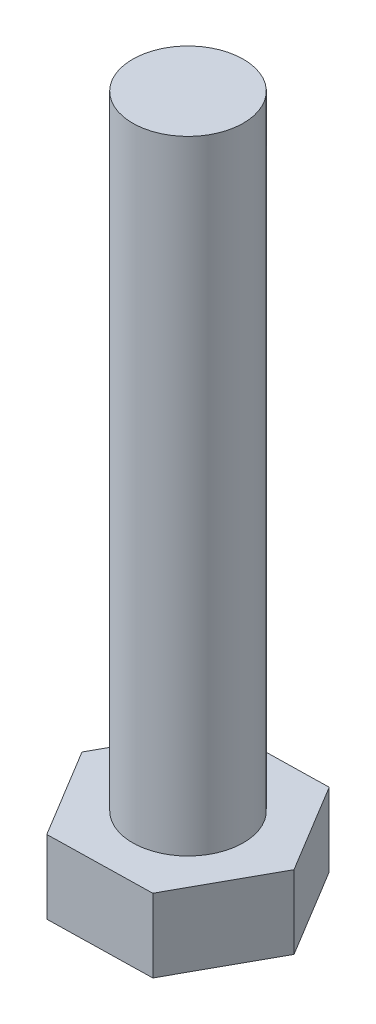
ISO-10303-21;
HEADER;
FILE_DESCRIPTION(('STEP AP214'),'2;1');
FILE_NAME('part.step','',(''),(''),'','','');
FILE_SCHEMA(('AUTOMOTIVE_DESIGN { 1 0 10303 214 1 1 1 1 }'));
ENDSEC;
DATA;
#1=APPLICATION_CONTEXT('core data for automotive mechanical design processes');
#2=APPLICATION_PROTOCOL_DEFINITION('international standard','automotive_design',2000,#1);
#3=PRODUCT_CONTEXT('',#1,'mechanical');
#4=PRODUCT('Part','Part','',(#3));
#5=PRODUCT_RELATED_PRODUCT_CATEGORY('part','',(#4));
#6=PRODUCT_DEFINITION_FORMATION('','',#4);
#7=PRODUCT_DEFINITION_CONTEXT('part definition',#1,'design');
#8=PRODUCT_DEFINITION('design','',#6,#7);
#9=PRODUCT_DEFINITION_SHAPE('','',#8);
#10=(LENGTH_UNIT() NAMED_UNIT(*) SI_UNIT(.MILLI.,.METRE.));
#11=(NAMED_UNIT(*) PLANE_ANGLE_UNIT() SI_UNIT($,.RADIAN.));
#12=(NAMED_UNIT(*) SI_UNIT($,.STERADIAN.) SOLID_ANGLE_UNIT());
#13=UNCERTAINTY_MEASURE_WITH_UNIT(LENGTH_MEASURE(1.E-05),#10,'distance_accuracy_value','');
#14=(GEOMETRIC_REPRESENTATION_CONTEXT(3) GLOBAL_UNCERTAINTY_ASSIGNED_CONTEXT((#13)) GLOBAL_UNIT_ASSIGNED_CONTEXT((#10,
#11,#12)) REPRESENTATION_CONTEXT('',''));
#15=CARTESIAN_POINT('',(0.,0.,0.));
#16=DIRECTION('',(0.,0.,1.));
#17=DIRECTION('',(1.,0.,0.));
#18=AXIS2_PLACEMENT_3D('',#15,#16,#17);
#19=CARTESIAN_POINT('',(-3.62049862835337,5.3,6.57459679489356));
#20=DIRECTION('',(-0.0202323001144248,0.,-0.999795306066237));
#21=DIRECTION('',(-0.999795306066237,0.,0.0202323001144248));
#22=AXIS2_PLACEMENT_3D('',#19,#20,#21);
#23=PLANE('',#22);
#24=DIRECTION('',(0.999795306066237,0.,-0.0202323001144248));
#25=VECTOR('',#24,1.);
#26=CARTESIAN_POINT('',(-3.62049862835337,0.,6.57459679489356));
#27=LINE('',#26,#25);
#28=CARTESIAN_POINT('',(-3.62049862835337,0.,6.57459679489356));
#29=VERTEX_POINT('',#28);
#30=CARTESIAN_POINT('',(3.88351852984089,0.,6.42274218396752));
#31=VERTEX_POINT('',#30);
#32=EDGE_CURVE('E130',#29,#31,#27,.T.);
#33=ORIENTED_EDGE('',*,*,#32,.T.);
#34=DIRECTION('',(0.,-1.,0.));
#35=VECTOR('',#34,1.);
#36=CARTESIAN_POINT('',(3.88351852984089,5.3,6.42274218396752));
#37=LINE('',#36,#35);
#38=CARTESIAN_POINT('',(3.88351852984089,5.3,6.42274218396752));
#39=VERTEX_POINT('',#38);
#40=EDGE_CURVE('E42',#39,#31,#37,.T.);
#41=ORIENTED_EDGE('',*,*,#40,.F.);
#42=DIRECTION('',(0.999795306066237,0.,-0.0202323001144248));
#43=VECTOR('',#42,1.);
#44=CARTESIAN_POINT('',(-3.62049862835337,5.3,6.57459679489356));
#45=LINE('',#44,#43);
#46=CARTESIAN_POINT('',(-3.62049862835337,5.3,6.57459679489356));
#47=VERTEX_POINT('',#46);
#48=EDGE_CURVE('E147',#47,#39,#45,.T.);
#49=ORIENTED_EDGE('',*,*,#48,.F.);
#50=DIRECTION('',(0.,-1.,0.));
#51=VECTOR('',#50,1.);
#52=CARTESIAN_POINT('',(-3.62049862835337,5.3,6.57459679489356));
#53=LINE('',#52,#51);
#54=EDGE_CURVE('E126',#47,#29,#53,.T.);
#55=ORIENTED_EDGE('',*,*,#54,.T.);
#56=EDGE_LOOP('',(#33,#41,#49,#55));
#57=FACE_BOUND('',#56,.T.);
#58=ADVANCED_FACE('F39',(#57),#23,.F.);
#59=CARTESIAN_POINT('',(3.88351852984089,5.3,6.42274218396752));
#60=DIRECTION('',(-0.875964283695011,0.,-0.482375967157036));
#61=DIRECTION('',(-0.482375967157036,0.,0.875964283695011));
#62=AXIS2_PLACEMENT_3D('',#59,#60,#61);
#63=PLANE('',#62);
#64=DIRECTION('',(0.482375967157036,0.,-0.875964283695011));
#65=VECTOR('',#64,1.);
#66=CARTESIAN_POINT('',(3.88351852984089,0.,6.42274218396752));
#67=LINE('',#66,#65);
#68=CARTESIAN_POINT('',(7.50401715819426,0.,-0.151854610926049));
#69=VERTEX_POINT('',#68);
#70=EDGE_CURVE('E134',#31,#69,#67,.T.);
#71=ORIENTED_EDGE('',*,*,#70,.T.);
#72=DIRECTION('',(0.,-1.,0.));
#73=VECTOR('',#72,1.);
#74=CARTESIAN_POINT('',(7.50401715819426,5.3,-0.151854610926049));
#75=LINE('',#74,#73);
#76=CARTESIAN_POINT('',(7.50401715819426,5.3,-0.151854610926049));
#77=VERTEX_POINT('',#76);
#78=EDGE_CURVE('E153',#77,#69,#75,.T.);
#79=ORIENTED_EDGE('',*,*,#78,.F.);
#80=DIRECTION('',(0.482375967157036,0.,-0.875964283695011));
#81=VECTOR('',#80,1.);
#82=CARTESIAN_POINT('',(3.88351852984089,5.3,6.42274218396752));
#83=LINE('',#82,#81);
#84=EDGE_CURVE('E95',#39,#77,#83,.T.);
#85=ORIENTED_EDGE('',*,*,#84,.F.);
#86=ORIENTED_EDGE('',*,*,#40,.T.);
#87=EDGE_LOOP('',(#71,#79,#85,#86));
#88=FACE_BOUND('',#87,.T.);
#89=ADVANCED_FACE('F160',(#88),#63,.F.);
#90=CARTESIAN_POINT('',(7.50401715819426,5.3,-0.151854610926049));
#91=DIRECTION('',(-0.855731983580587,0.,0.517419338909201));
#92=DIRECTION('',(0.517419338909201,0.,0.855731983580587));
#93=AXIS2_PLACEMENT_3D('',#90,#91,#92);
#94=PLANE('',#93);
#95=DIRECTION('',(-0.517419338909201,0.,-0.855731983580587));
#96=VECTOR('',#95,1.);
#97=CARTESIAN_POINT('',(7.50401715819426,0.,-0.151854610926049));
#98=LINE('',#97,#96);
#99=CARTESIAN_POINT('',(3.62049862835337,0.,-6.57459679489356));
#100=VERTEX_POINT('',#99);
#101=EDGE_CURVE('E138',#69,#100,#98,.T.);
#102=ORIENTED_EDGE('',*,*,#101,.T.);
#103=DIRECTION('',(0.,-1.,0.));
#104=VECTOR('',#103,1.);
#105=CARTESIAN_POINT('',(3.62049862835337,5.3,-6.57459679489356));
#106=LINE('',#105,#104);
#107=CARTESIAN_POINT('',(3.62049862835337,5.3,-6.57459679489356));
#108=VERTEX_POINT('',#107);
#109=EDGE_CURVE('E119',#108,#100,#106,.T.);
#110=ORIENTED_EDGE('',*,*,#109,.F.);
#111=DIRECTION('',(-0.517419338909201,0.,-0.855731983580587));
#112=VECTOR('',#111,1.);
#113=CARTESIAN_POINT('',(7.50401715819426,5.3,-0.151854610926049));
#114=LINE('',#113,#112);
#115=EDGE_CURVE('E108',#77,#108,#114,.T.);
#116=ORIENTED_EDGE('',*,*,#115,.F.);
#117=ORIENTED_EDGE('',*,*,#78,.T.);
#118=EDGE_LOOP('',(#102,#110,#116,#117));
#119=FACE_BOUND('',#118,.T.);
#120=ADVANCED_FACE('F166',(#119),#94,.F.);
#121=CARTESIAN_POINT('',(3.62049862835337,5.3,-6.57459679489356));
#122=DIRECTION('',(0.0202323001144248,0.,0.999795306066237));
#123=DIRECTION('',(0.999795306066237,0.,-0.0202323001144248));
#124=AXIS2_PLACEMENT_3D('',#121,#122,#123);
#125=PLANE('',#124);
#126=DIRECTION('',(-0.999795306066237,0.,0.0202323001144248));
#127=VECTOR('',#126,1.);
#128=CARTESIAN_POINT('',(3.62049862835337,0.,-6.57459679489356));
#129=LINE('',#128,#127);
#130=CARTESIAN_POINT('',(-3.88351852984089,0.,-6.42274218396751));
#131=VERTEX_POINT('',#130);
#132=EDGE_CURVE('E117',#100,#131,#129,.T.);
#133=ORIENTED_EDGE('',*,*,#132,.T.);
#134=DIRECTION('',(0.,-1.,0.));
#135=VECTOR('',#134,1.);
#136=CARTESIAN_POINT('',(-3.88351852984089,5.3,-6.42274218396751));
#137=LINE('',#136,#135);
#138=CARTESIAN_POINT('',(-3.88351852984089,5.3,-6.42274218396751));
#139=VERTEX_POINT('',#138);
#140=EDGE_CURVE('E114',#139,#131,#137,.T.);
#141=ORIENTED_EDGE('',*,*,#140,.F.);
#142=DIRECTION('',(-0.999795306066237,0.,0.0202323001144248));
#143=VECTOR('',#142,1.);
#144=CARTESIAN_POINT('',(3.62049862835337,5.3,-6.57459679489356));
#145=LINE('',#144,#143);
#146=EDGE_CURVE('E102',#108,#139,#145,.T.);
#147=ORIENTED_EDGE('',*,*,#146,.F.);
#148=ORIENTED_EDGE('',*,*,#109,.T.);
#149=EDGE_LOOP('',(#133,#141,#147,#148));
#150=FACE_BOUND('',#149,.T.);
#151=ADVANCED_FACE('F115',(#150),#125,.F.);
#152=CARTESIAN_POINT('',(-3.88351852984089,5.3,-6.42274218396751));
#153=DIRECTION('',(0.875964283695011,0.,0.482375967157036));
#154=DIRECTION('',(0.482375967157036,0.,-0.875964283695011));
#155=AXIS2_PLACEMENT_3D('',#152,#153,#154);
#156=PLANE('',#155);
#157=DIRECTION('',(-0.482375967157036,0.,0.875964283695011));
#158=VECTOR('',#157,1.);
#159=CARTESIAN_POINT('',(-3.88351852984089,0.,-6.42274218396751));
#160=LINE('',#159,#158);
#161=CARTESIAN_POINT('',(-7.50401715819426,0.,0.151854610926049));
#162=VERTEX_POINT('',#161);
#163=EDGE_CURVE('E80',#131,#162,#160,.T.);
#164=ORIENTED_EDGE('',*,*,#163,.T.);
#165=DIRECTION('',(0.,-1.,0.));
#166=VECTOR('',#165,1.);
#167=CARTESIAN_POINT('',(-7.50401715819426,5.3,0.151854610926049));
#168=LINE('',#167,#166);
#169=CARTESIAN_POINT('',(-7.50401715819426,5.3,0.151854610926049));
#170=VERTEX_POINT('',#169);
#171=EDGE_CURVE('E120',#170,#162,#168,.T.);
#172=ORIENTED_EDGE('',*,*,#171,.F.);
#173=DIRECTION('',(-0.482375967157036,0.,0.875964283695011));
#174=VECTOR('',#173,1.);
#175=CARTESIAN_POINT('',(-3.88351852984089,5.3,-6.42274218396751));
#176=LINE('',#175,#174);
#177=EDGE_CURVE('E106',#139,#170,#176,.T.);
#178=ORIENTED_EDGE('',*,*,#177,.F.);
#179=ORIENTED_EDGE('',*,*,#140,.T.);
#180=EDGE_LOOP('',(#164,#172,#178,#179));
#181=FACE_BOUND('',#180,.T.);
#182=ADVANCED_FACE('F122',(#181),#156,.F.);
#183=CARTESIAN_POINT('',(-7.50401715819426,5.3,0.151854610926049));
#184=DIRECTION('',(0.855731983580587,0.,-0.517419338909201));
#185=DIRECTION('',(-0.517419338909201,0.,-0.855731983580587));
#186=AXIS2_PLACEMENT_3D('',#183,#184,#185);
#187=PLANE('',#186);
#188=DIRECTION('',(0.517419338909201,0.,0.855731983580587));
#189=VECTOR('',#188,1.);
#190=CARTESIAN_POINT('',(-7.50401715819426,0.,0.151854610926049));
#191=LINE('',#190,#189);
#192=EDGE_CURVE('E86',#162,#29,#191,.T.);
#193=ORIENTED_EDGE('',*,*,#192,.T.);
#194=ORIENTED_EDGE('',*,*,#54,.F.);
#195=DIRECTION('',(0.517419338909201,0.,0.855731983580587));
#196=VECTOR('',#195,1.);
#197=CARTESIAN_POINT('',(-7.50401715819426,5.3,0.151854610926049));
#198=LINE('',#197,#196);
#199=EDGE_CURVE('E57',#170,#47,#198,.T.);
#200=ORIENTED_EDGE('',*,*,#199,.F.);
#201=ORIENTED_EDGE('',*,*,#171,.T.);
#202=EDGE_LOOP('',(#193,#194,#200,#201));
#203=FACE_BOUND('',#202,.T.);
#204=ADVANCED_FACE('F186',(#203),#187,.F.);
#205=CARTESIAN_POINT('',(0.,5.3,0.));
#206=DIRECTION('',(0.,1.,0.));
#207=DIRECTION('',(0.,0.,1.));
#208=AXIS2_PLACEMENT_3D('',#205,#206,#207);
#209=PLANE('',#208);
#210=CARTESIAN_POINT('',(0.,5.3,0.));
#211=DIRECTION('',(0.,1.,0.));
#212=DIRECTION('',(0.,0.,1.));
#213=AXIS2_PLACEMENT_3D('',#210,#211,#212);
#214=CIRCLE('',#213,4.);
#215=CARTESIAN_POINT('',(0.,5.30000000000001,-4.));
#216=VERTEX_POINT('',#215);
#217=EDGE_CURVE('E11',#216,#216,#214,.T.);
#218=ORIENTED_EDGE('',*,*,#217,.F.);
#219=EDGE_LOOP('',(#218));
#220=FACE_BOUND('',#219,.T.);
#221=ORIENTED_EDGE('',*,*,#48,.T.);
#222=ORIENTED_EDGE('',*,*,#84,.T.);
#223=ORIENTED_EDGE('',*,*,#115,.T.);
#224=ORIENTED_EDGE('',*,*,#146,.T.);
#225=ORIENTED_EDGE('',*,*,#177,.T.);
#226=ORIENTED_EDGE('',*,*,#199,.T.);
#227=EDGE_LOOP('',(#221,#222,#223,#224,#225,#226));
#228=FACE_BOUND('',#227,.T.);
#229=ADVANCED_FACE('F104',(#220,#228),#209,.T.);
#230=CARTESIAN_POINT('',(0.,0.,0.));
#231=DIRECTION('',(0.,1.,0.));
#232=DIRECTION('',(0.,0.,1.));
#233=AXIS2_PLACEMENT_3D('',#230,#231,#232);
#234=PLANE('',#233);
#235=ORIENTED_EDGE('',*,*,#32,.F.);
#236=ORIENTED_EDGE('',*,*,#192,.F.);
#237=ORIENTED_EDGE('',*,*,#163,.F.);
#238=ORIENTED_EDGE('',*,*,#132,.F.);
#239=ORIENTED_EDGE('',*,*,#101,.F.);
#240=ORIENTED_EDGE('',*,*,#70,.F.);
#241=EDGE_LOOP('',(#235,#236,#237,#238,#239,#240));
#242=FACE_BOUND('',#241,.T.);
#243=ADVANCED_FACE('F165',(#242),#234,.F.);
#244=CARTESIAN_POINT('',(0.,50.3,0.));
#245=DIRECTION('',(0.,-1.,0.));
#246=DIRECTION('',(0.,0.,-1.));
#247=AXIS2_PLACEMENT_3D('',#244,#245,#246);
#248=CYLINDRICAL_SURFACE('',#247,4.);
#249=CARTESIAN_POINT('',(0.,50.3,0.));
#250=DIRECTION('',(0.,1.,0.));
#251=DIRECTION('',(0.,0.,1.));
#252=AXIS2_PLACEMENT_3D('',#249,#250,#251);
#253=CIRCLE('',#252,4.);
#254=CARTESIAN_POINT('',(0.,50.3,-4.));
#255=VERTEX_POINT('',#254);
#256=EDGE_CURVE('E135',#255,#255,#253,.T.);
#257=CARTESIAN_POINT('',(0.,50.3,-4.));
#258=CARTESIAN_POINT('',(0.,49.83125,-4.));
#259=CARTESIAN_POINT('',(0.,49.3625,-4.));
#260=CARTESIAN_POINT('',(0.,48.425,-4.));
#261=CARTESIAN_POINT('',(0.,47.95625,-4.));
#262=CARTESIAN_POINT('',(0.,47.01875,-4.));
#263=CARTESIAN_POINT('',(0.,46.55,-4.));
#264=CARTESIAN_POINT('',(0.,45.6125,-4.));
#265=CARTESIAN_POINT('',(0.,45.14375,-4.));
#266=CARTESIAN_POINT('',(0.,44.20625,-4.));
#267=CARTESIAN_POINT('',(0.,43.7375,-4.));
#268=CARTESIAN_POINT('',(0.,42.8,-4.));
#269=CARTESIAN_POINT('',(0.,42.33125,-4.));
#270=CARTESIAN_POINT('',(0.,41.39375,-4.));
#271=CARTESIAN_POINT('',(0.,40.925,-4.));
#272=CARTESIAN_POINT('',(0.,39.9875,-4.));
#273=CARTESIAN_POINT('',(0.,39.51875,-4.));
#274=CARTESIAN_POINT('',(0.,38.58125,-4.));
#275=CARTESIAN_POINT('',(0.,38.1125,-4.));
#276=CARTESIAN_POINT('',(0.,37.175,-4.));
#277=CARTESIAN_POINT('',(0.,36.70625,-4.));
#278=CARTESIAN_POINT('',(0.,35.76875,-4.));
#279=CARTESIAN_POINT('',(0.,35.3,-4.));
#280=CARTESIAN_POINT('',(0.,34.3625,-4.));
#281=CARTESIAN_POINT('',(0.,33.89375,-4.));
#282=CARTESIAN_POINT('',(0.,32.95625,-4.));
#283=CARTESIAN_POINT('',(0.,32.4875,-4.));
#284=CARTESIAN_POINT('',(0.,31.55,-4.));
#285=CARTESIAN_POINT('',(0.,31.08125,-4.));
#286=CARTESIAN_POINT('',(0.,30.14375,-4.));
#287=CARTESIAN_POINT('',(0.,29.675,-4.));
#288=CARTESIAN_POINT('',(0.,28.7375,-4.));
#289=CARTESIAN_POINT('',(0.,28.26875,-4.));
#290=CARTESIAN_POINT('',(0.,27.33125,-4.));
#291=CARTESIAN_POINT('',(0.,26.8625,-4.));
#292=CARTESIAN_POINT('',(0.,25.925,-4.));
#293=CARTESIAN_POINT('',(0.,25.45625,-4.));
#294=CARTESIAN_POINT('',(0.,24.51875,-4.));
#295=CARTESIAN_POINT('',(0.,24.05,-4.));
#296=CARTESIAN_POINT('',(0.,23.1125,-4.));
#297=CARTESIAN_POINT('',(0.,22.64375,-4.));
#298=CARTESIAN_POINT('',(0.,21.70625,-4.));
#299=CARTESIAN_POINT('',(0.,21.2375,-4.));
#300=CARTESIAN_POINT('',(0.,20.3,-4.));
#301=CARTESIAN_POINT('',(0.,19.83125,-4.));
#302=CARTESIAN_POINT('',(0.,18.89375,-4.));
#303=CARTESIAN_POINT('',(0.,18.425,-4.));
#304=CARTESIAN_POINT('',(0.,17.4875,-4.));
#305=CARTESIAN_POINT('',(0.,17.01875,-4.));
#306=CARTESIAN_POINT('',(0.,16.08125,-4.));
#307=CARTESIAN_POINT('',(0.,15.6125,-4.));
#308=CARTESIAN_POINT('',(0.,14.675,-4.));
#309=CARTESIAN_POINT('',(0.,14.20625,-4.));
#310=CARTESIAN_POINT('',(0.,13.26875,-4.));
#311=CARTESIAN_POINT('',(0.,12.8,-4.));
#312=CARTESIAN_POINT('',(0.,11.8625,-4.));
#313=CARTESIAN_POINT('',(0.,11.39375,-4.));
#314=CARTESIAN_POINT('',(0.,10.45625,-4.));
#315=CARTESIAN_POINT('',(0.,9.9875,-4.));
#316=CARTESIAN_POINT('',(0.,9.05000000000001,-4.));
#317=CARTESIAN_POINT('',(0.,8.58125000000001,-4.));
#318=CARTESIAN_POINT('',(0.,7.64375000000001,-4.));
#319=CARTESIAN_POINT('',(0.,7.17500000000001,-4.));
#320=CARTESIAN_POINT('',(0.,6.2375,-4.));
#321=CARTESIAN_POINT('',(0.,5.76875000000001,-4.));
#322=CARTESIAN_POINT('',(0.,5.30000000000001,-4.));
#323=B_SPLINE_CURVE_WITH_KNOTS('',3,(#257,#258,#259,#260,#261,#262,#263,#264,#265,#266,#267,
#268,#269,#270,#271,#272,#273,#274,#275,#276,#277,#278,#279,#280,#281,#282,#283,#284,#285,#286,
#287,#288,#289,#290,#291,#292,#293,#294,#295,#296,#297,#298,#299,#300,#301,#302,#303,#304,#305,
#306,#307,#308,#309,#310,#311,#312,#313,#314,#315,#316,#317,#318,#319,#320,#321,#322),
.UNSPECIFIED.,.F.,.F.,(4,2,2,2,2,2,2,2,2,2,2,2,2,2,2,2,2,2,2,2,2,2,2,2,2,2,2,2,2,2,2,2,4),(0.,
1.40625,2.8125,4.21874999999999,5.625,7.03125,8.43749999999999,9.84374999999999,11.25,12.65625,
14.0625,15.46875,16.875,18.28125,19.6875,21.09375,22.5,23.90625,25.3125,26.71875,28.125,
29.53125,30.9375,32.34375,33.75,35.15625,36.5625,37.96875,39.375,40.78125,42.1875,43.59375,45.),.UNSPECIFIED.);
#324=EDGE_CURVE('BSEAM179',#255,#216,#323,.T.);
#325=ORIENTED_EDGE('',*,*,#256,.F.);
#326=ORIENTED_EDGE('',*,*,#217,.T.);
#327=ORIENTED_EDGE('',*,*,#324,.T.);
#328=ORIENTED_EDGE('',*,*,#324,.F.);
#329=EDGE_LOOP('',(#325,#327,#326,#328));
#330=FACE_BOUND('',#329,.T.);
#331=ADVANCED_FACE('F179',(#330),#248,.T.);
#332=CARTESIAN_POINT('',(0.,50.3,0.));
#333=DIRECTION('',(0.,1.,0.));
#334=DIRECTION('',(0.,0.,1.));
#335=AXIS2_PLACEMENT_3D('',#332,#333,#334);
#336=PLANE('',#335);
#337=ORIENTED_EDGE('',*,*,#256,.T.);
#338=EDGE_LOOP('',(#337));
#339=FACE_BOUND('',#338,.T.);
#340=ADVANCED_FACE('F177',(#339),#336,.T.);
#341=CLOSED_SHELL('',(#58,#89,#120,#151,#182,#204,#229,#243,#331,#340));
#342=MANIFOLD_SOLID_BREP('B2',#341);
#343=ADVANCED_BREP_SHAPE_REPRESENTATION('',(#18,#342),#14);
#344=SHAPE_DEFINITION_REPRESENTATION(#9,#343);
ENDSEC;
END-ISO-10303-21;
